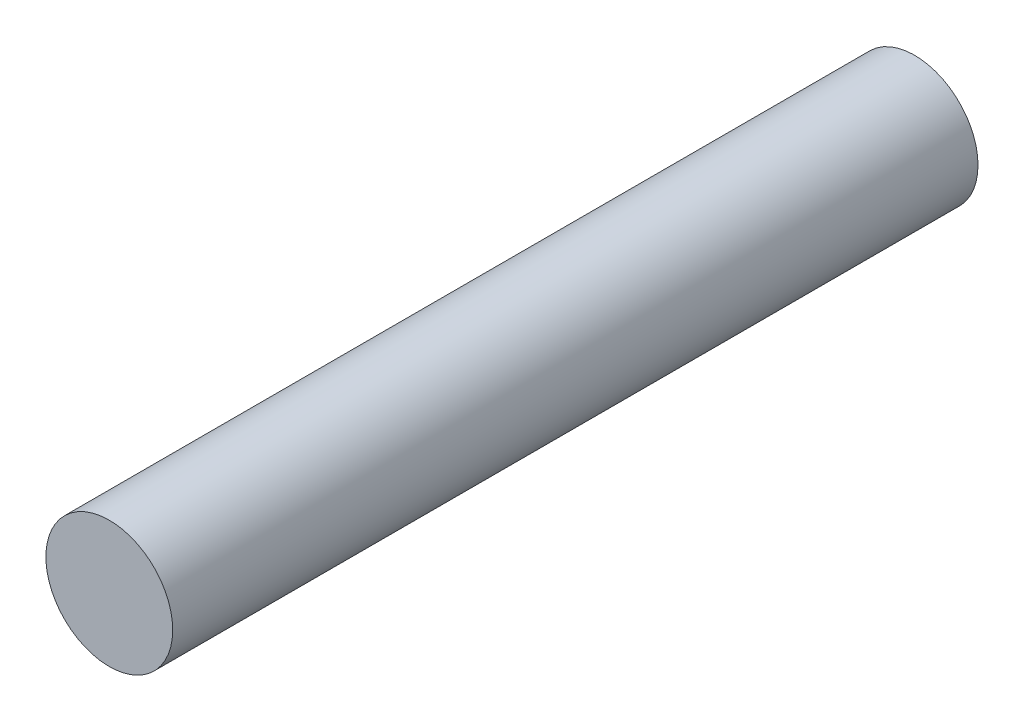
ISO-10303-21;
HEADER;
FILE_DESCRIPTION(('STEP AP214'),'2;1');
FILE_NAME('part.step','',(''),(''),'','','');
FILE_SCHEMA(('AUTOMOTIVE_DESIGN { 1 0 10303 214 1 1 1 1 }'));
ENDSEC;
DATA;
#1=APPLICATION_CONTEXT('core data for automotive mechanical design processes');
#2=APPLICATION_PROTOCOL_DEFINITION('international standard','automotive_design',2000,#1);
#3=PRODUCT_CONTEXT('',#1,'mechanical');
#4=PRODUCT('Part','Part','',(#3));
#5=PRODUCT_RELATED_PRODUCT_CATEGORY('part','',(#4));
#6=PRODUCT_DEFINITION_FORMATION('','',#4);
#7=PRODUCT_DEFINITION_CONTEXT('part definition',#1,'design');
#8=PRODUCT_DEFINITION('design','',#6,#7);
#9=PRODUCT_DEFINITION_SHAPE('','',#8);
#10=(LENGTH_UNIT() NAMED_UNIT(*) SI_UNIT(.MILLI.,.METRE.));
#11=(NAMED_UNIT(*) PLANE_ANGLE_UNIT() SI_UNIT($,.RADIAN.));
#12=(NAMED_UNIT(*) SI_UNIT($,.STERADIAN.) SOLID_ANGLE_UNIT());
#13=UNCERTAINTY_MEASURE_WITH_UNIT(LENGTH_MEASURE(1.E-05),#10,'distance_accuracy_value','');
#14=(GEOMETRIC_REPRESENTATION_CONTEXT(3) GLOBAL_UNCERTAINTY_ASSIGNED_CONTEXT((#13)) GLOBAL_UNIT_ASSIGNED_CONTEXT((#10,
#11,#12)) REPRESENTATION_CONTEXT('',''));
#15=CARTESIAN_POINT('',(0.,0.,0.));
#16=DIRECTION('',(0.,0.,1.));
#17=DIRECTION('',(1.,0.,0.));
#18=AXIS2_PLACEMENT_3D('',#15,#16,#17);
#19=CARTESIAN_POINT('',(0.,0.,12.7));
#20=DIRECTION('',(0.,0.,-1.));
#21=DIRECTION('',(-1.,0.,0.));
#22=AXIS2_PLACEMENT_3D('',#19,#20,#21);
#23=CYLINDRICAL_SURFACE('',#22,1.);
#24=CARTESIAN_POINT('',(0.,0.,12.7));
#25=DIRECTION('',(0.,0.,1.));
#26=DIRECTION('',(1.,0.,0.));
#27=AXIS2_PLACEMENT_3D('',#24,#25,#26);
#28=CIRCLE('',#27,1.);
#29=CARTESIAN_POINT('',(1.,0.,12.7));
#30=VERTEX_POINT('',#29);
#31=EDGE_CURVE('E10',#30,#30,#28,.T.);
#32=ORIENTED_EDGE('',*,*,#31,.F.);
#33=EDGE_LOOP('',(#32));
#34=FACE_BOUND('',#33,.T.);
#35=CARTESIAN_POINT('',(0.,0.,0.));
#36=DIRECTION('',(0.,0.,1.));
#37=DIRECTION('',(1.,0.,0.));
#38=AXIS2_PLACEMENT_3D('',#35,#36,#37);
#39=CIRCLE('',#38,1.);
#40=CARTESIAN_POINT('',(1.,0.,0.));
#41=VERTEX_POINT('',#40);
#42=EDGE_CURVE('E40',#41,#41,#39,.T.);
#43=ORIENTED_EDGE('',*,*,#42,.T.);
#44=EDGE_LOOP('',(#43));
#45=FACE_BOUND('',#44,.T.);
#46=ADVANCED_FACE('F37',(#34,#45),#23,.T.);
#47=CARTESIAN_POINT('',(0.,0.,12.7));
#48=DIRECTION('',(0.,0.,1.));
#49=DIRECTION('',(1.,0.,0.));
#50=AXIS2_PLACEMENT_3D('',#47,#48,#49);
#51=PLANE('',#50);
#52=ORIENTED_EDGE('',*,*,#31,.T.);
#53=EDGE_LOOP('',(#52));
#54=FACE_BOUND('',#53,.T.);
#55=ADVANCED_FACE('F54',(#54),#51,.T.);
#56=CARTESIAN_POINT('',(0.,0.,0.));
#57=DIRECTION('',(0.,0.,1.));
#58=DIRECTION('',(1.,0.,0.));
#59=AXIS2_PLACEMENT_3D('',#56,#57,#58);
#60=PLANE('',#59);
#61=ORIENTED_EDGE('',*,*,#42,.F.);
#62=EDGE_LOOP('',(#61));
#63=FACE_BOUND('',#62,.T.);
#64=ADVANCED_FACE('F52',(#63),#60,.F.);
#65=CLOSED_SHELL('',(#46,#55,#64));
#66=MANIFOLD_SOLID_BREP('B2',#65);
#67=ADVANCED_BREP_SHAPE_REPRESENTATION('',(#18,#66),#14);
#68=SHAPE_DEFINITION_REPRESENTATION(#9,#67);
ENDSEC;
END-ISO-10303-21;
